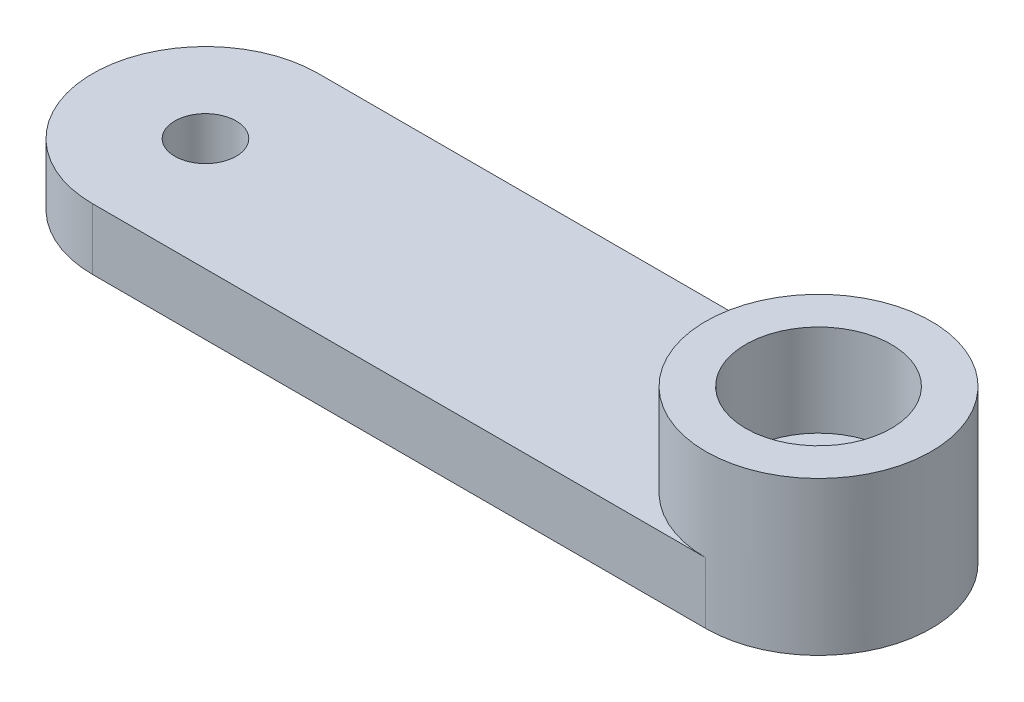
ISO-10303-21;
HEADER;
FILE_DESCRIPTION(('STEP AP214'),'2;1');
FILE_NAME('part.step','',(''),(''),'','','');
FILE_SCHEMA(('AUTOMOTIVE_DESIGN { 1 0 10303 214 1 1 1 1 }'));
ENDSEC;
DATA;
#1=APPLICATION_CONTEXT('core data for automotive mechanical design processes');
#2=APPLICATION_PROTOCOL_DEFINITION('international standard','automotive_design',2000,#1);
#3=PRODUCT_CONTEXT('',#1,'mechanical');
#4=PRODUCT('Part','Part','',(#3));
#5=PRODUCT_RELATED_PRODUCT_CATEGORY('part','',(#4));
#6=PRODUCT_DEFINITION_FORMATION('','',#4);
#7=PRODUCT_DEFINITION_CONTEXT('part definition',#1,'design');
#8=PRODUCT_DEFINITION('design','',#6,#7);
#9=PRODUCT_DEFINITION_SHAPE('','',#8);
#10=(LENGTH_UNIT() NAMED_UNIT(*) SI_UNIT(.MILLI.,.METRE.));
#11=(NAMED_UNIT(*) PLANE_ANGLE_UNIT() SI_UNIT($,.RADIAN.));
#12=(NAMED_UNIT(*) SI_UNIT($,.STERADIAN.) SOLID_ANGLE_UNIT());
#13=UNCERTAINTY_MEASURE_WITH_UNIT(LENGTH_MEASURE(1.E-05),#10,'distance_accuracy_value','');
#14=(GEOMETRIC_REPRESENTATION_CONTEXT(3) GLOBAL_UNCERTAINTY_ASSIGNED_CONTEXT((#13)) GLOBAL_UNIT_ASSIGNED_CONTEXT((#10,
#11,#12)) REPRESENTATION_CONTEXT('',''));
#15=CARTESIAN_POINT('',(0.,0.,0.));
#16=DIRECTION('',(0.,0.,1.));
#17=DIRECTION('',(1.,0.,0.));
#18=AXIS2_PLACEMENT_3D('',#15,#16,#17);
#19=CARTESIAN_POINT('',(0.,0.,0.));
#20=DIRECTION('',(0.,-1.,0.));
#21=DIRECTION('',(0.,0.,-1.));
#22=AXIS2_PLACEMENT_3D('',#19,#20,#21);
#23=CYLINDRICAL_SURFACE('',#22,1.);
#24=CARTESIAN_POINT('',(0.,0.,0.));
#25=DIRECTION('',(0.,-1.,0.));
#26=DIRECTION('',(0.,0.,-1.));
#27=AXIS2_PLACEMENT_3D('',#24,#25,#26);
#28=CIRCLE('',#27,1.);
#29=CARTESIAN_POINT('',(0.,0.,-1.));
#30=VERTEX_POINT('',#29);
#31=EDGE_CURVE('E109',#30,#30,#28,.T.);
#32=ORIENTED_EDGE('',*,*,#31,.F.);
#33=EDGE_LOOP('',(#32));
#34=FACE_BOUND('',#33,.T.);
#35=CARTESIAN_POINT('',(0.,-0.5,0.));
#36=DIRECTION('',(0.,-1.,0.));
#37=DIRECTION('',(0.,0.,-1.));
#38=AXIS2_PLACEMENT_3D('',#35,#36,#37);
#39=CIRCLE('',#38,1.);
#40=CARTESIAN_POINT('',(0.,-0.5,-1.));
#41=VERTEX_POINT('',#40);
#42=EDGE_CURVE('E41',#41,#41,#39,.F.);
#43=ORIENTED_EDGE('',*,*,#42,.F.);
#44=EDGE_LOOP('',(#43));
#45=FACE_BOUND('',#44,.T.);
#46=ADVANCED_FACE('F37',(#34,#45),#23,.F.);
#47=CARTESIAN_POINT('',(0.,-2.,0.));
#48=DIRECTION('',(0.,1.,0.));
#49=DIRECTION('',(0.,0.,1.));
#50=AXIS2_PLACEMENT_3D('',#47,#48,#49);
#51=CYLINDRICAL_SURFACE('',#50,3.68);
#52=DIRECTION('',(0.,-1.,0.));
#53=VECTOR('',#52,1.);
#54=CARTESIAN_POINT('',(0.,0.,-3.68));
#55=LINE('',#54,#53);
#56=CARTESIAN_POINT('',(0.,0.,-3.68));
#57=VERTEX_POINT('',#56);
#58=CARTESIAN_POINT('',(0.,-2.,-3.68));
#59=VERTEX_POINT('',#58);
#60=EDGE_CURVE('E52',#57,#59,#55,.T.);
#61=ORIENTED_EDGE('',*,*,#60,.F.);
#62=CARTESIAN_POINT('',(0.,0.,0.));
#63=DIRECTION('',(0.,-1.,0.));
#64=DIRECTION('',(0.,0.,-1.));
#65=AXIS2_PLACEMENT_3D('',#62,#63,#64);
#66=CIRCLE('',#65,3.68);
#67=CARTESIAN_POINT('',(0.,0.,3.68));
#68=VERTEX_POINT('',#67);
#69=EDGE_CURVE('E11',#57,#68,#66,.F.);
#70=ORIENTED_EDGE('',*,*,#69,.T.);
#71=DIRECTION('',(0.,-1.,0.));
#72=VECTOR('',#71,1.);
#73=CARTESIAN_POINT('',(0.,0.,3.68));
#74=LINE('',#73,#72);
#75=CARTESIAN_POINT('',(0.,-2.,3.68));
#76=VERTEX_POINT('',#75);
#77=EDGE_CURVE('E88',#68,#76,#74,.T.);
#78=ORIENTED_EDGE('',*,*,#77,.T.);
#79=CARTESIAN_POINT('',(0.,-2.,0.));
#80=DIRECTION('',(0.,1.,0.));
#81=DIRECTION('',(0.,0.,1.));
#82=AXIS2_PLACEMENT_3D('',#79,#80,#81);
#83=CIRCLE('',#82,3.68);
#84=EDGE_CURVE('E120',#76,#59,#83,.T.);
#85=ORIENTED_EDGE('',*,*,#84,.T.);
#86=EDGE_LOOP('',(#61,#70,#78,#85));
#87=FACE_BOUND('',#86,.T.);
#88=CARTESIAN_POINT('',(0.,3.,0.));
#89=DIRECTION('',(0.,1.,0.));
#90=DIRECTION('',(0.,0.,1.));
#91=AXIS2_PLACEMENT_3D('',#88,#89,#90);
#92=CIRCLE('',#91,3.68);
#93=CARTESIAN_POINT('',(0.,3.,3.68));
#94=VERTEX_POINT('',#93);
#95=EDGE_CURVE('E117',#94,#94,#92,.T.);
#96=ORIENTED_EDGE('',*,*,#95,.F.);
#97=EDGE_LOOP('',(#96));
#98=FACE_BOUND('',#97,.T.);
#99=ADVANCED_FACE('F39',(#87,#98),#51,.T.);
#100=CARTESIAN_POINT('',(0.,-2.,0.));
#101=DIRECTION('',(0.,1.,0.));
#102=DIRECTION('',(0.,0.,1.));
#103=AXIS2_PLACEMENT_3D('',#100,#101,#102);
#104=PLANE('',#103);
#105=CARTESIAN_POINT('',(0.,-2.,0.));
#106=DIRECTION('',(0.,-1.,0.));
#107=DIRECTION('',(0.,0.,-1.));
#108=AXIS2_PLACEMENT_3D('',#105,#106,#107);
#109=CIRCLE('',#108,2.);
#110=CARTESIAN_POINT('',(0.,-2.,-2.));
#111=VERTEX_POINT('',#110);
#112=EDGE_CURVE('E176',#111,#111,#109,.T.);
#113=ORIENTED_EDGE('',*,*,#112,.F.);
#114=EDGE_LOOP('',(#113));
#115=FACE_BOUND('',#114,.T.);
#116=CARTESIAN_POINT('',(-20.,-2.,0.));
#117=DIRECTION('',(0.,-1.,0.));
#118=DIRECTION('',(0.,0.,-1.));
#119=AXIS2_PLACEMENT_3D('',#116,#117,#118);
#120=CIRCLE('',#119,1.);
#121=CARTESIAN_POINT('',(-20.,-2.,-1.));
#122=VERTEX_POINT('',#121);
#123=EDGE_CURVE('E180',#122,#122,#120,.T.);
#124=ORIENTED_EDGE('',*,*,#123,.F.);
#125=EDGE_LOOP('',(#124));
#126=FACE_BOUND('',#125,.T.);
#127=ORIENTED_EDGE('',*,*,#84,.F.);
#128=DIRECTION('',(-1.,0.,0.));
#129=VECTOR('',#128,1.);
#130=CARTESIAN_POINT('',(0.,-2.,3.68));
#131=LINE('',#130,#129);
#132=CARTESIAN_POINT('',(-20.,-2.,3.68));
#133=VERTEX_POINT('',#132);
#134=EDGE_CURVE('E107',#76,#133,#131,.T.);
#135=ORIENTED_EDGE('',*,*,#134,.T.);
#136=CARTESIAN_POINT('',(-20.,-2.,0.));
#137=DIRECTION('',(0.,-1.,0.));
#138=DIRECTION('',(0.,0.,-1.));
#139=AXIS2_PLACEMENT_3D('',#136,#137,#138);
#140=CIRCLE('',#139,3.68);
#141=CARTESIAN_POINT('',(-20.,-2.,-3.68));
#142=VERTEX_POINT('',#141);
#143=EDGE_CURVE('E82',#133,#142,#140,.T.);
#144=ORIENTED_EDGE('',*,*,#143,.T.);
#145=DIRECTION('',(1.,0.,0.));
#146=VECTOR('',#145,1.);
#147=CARTESIAN_POINT('',(0.,-2.,-3.68));
#148=LINE('',#147,#146);
#149=EDGE_CURVE('E98',#142,#59,#148,.T.);
#150=ORIENTED_EDGE('',*,*,#149,.T.);
#151=EDGE_LOOP('',(#127,#135,#144,#150));
#152=FACE_BOUND('',#151,.T.);
#153=ADVANCED_FACE('F148',(#115,#126,#152),#104,.F.);
#154=CARTESIAN_POINT('',(0.,3.,0.));
#155=DIRECTION('',(0.,1.,0.));
#156=DIRECTION('',(0.,0.,1.));
#157=AXIS2_PLACEMENT_3D('',#154,#155,#156);
#158=PLANE('',#157);
#159=ORIENTED_EDGE('',*,*,#95,.T.);
#160=EDGE_LOOP('',(#159));
#161=FACE_BOUND('',#160,.T.);
#162=CARTESIAN_POINT('',(0.,3.,0.));
#163=DIRECTION('',(0.,1.,0.));
#164=DIRECTION('',(0.,0.,1.));
#165=AXIS2_PLACEMENT_3D('',#162,#163,#164);
#166=CIRCLE('',#165,2.375);
#167=CARTESIAN_POINT('',(0.,3.,2.375));
#168=VERTEX_POINT('',#167);
#169=EDGE_CURVE('E112',#168,#168,#166,.T.);
#170=ORIENTED_EDGE('',*,*,#169,.F.);
#171=EDGE_LOOP('',(#170));
#172=FACE_BOUND('',#171,.T.);
#173=ADVANCED_FACE('F137',(#161,#172),#158,.T.);
#174=CARTESIAN_POINT('',(0.,3.,0.));
#175=DIRECTION('',(0.,-1.,0.));
#176=DIRECTION('',(0.,0.,-1.));
#177=AXIS2_PLACEMENT_3D('',#174,#175,#176);
#178=CYLINDRICAL_SURFACE('',#177,2.375);
#179=ORIENTED_EDGE('',*,*,#169,.T.);
#180=EDGE_LOOP('',(#179));
#181=FACE_BOUND('',#180,.T.);
#182=CARTESIAN_POINT('',(0.,0.,0.));
#183=DIRECTION('',(0.,1.,0.));
#184=DIRECTION('',(0.,0.,1.));
#185=AXIS2_PLACEMENT_3D('',#182,#183,#184);
#186=CIRCLE('',#185,2.375);
#187=CARTESIAN_POINT('',(0.,0.,2.375));
#188=VERTEX_POINT('',#187);
#189=EDGE_CURVE('E46',#188,#188,#186,.F.);
#190=ORIENTED_EDGE('',*,*,#189,.T.);
#191=EDGE_LOOP('',(#190));
#192=FACE_BOUND('',#191,.T.);
#193=ADVANCED_FACE('F125',(#181,#192),#178,.F.);
#194=CARTESIAN_POINT('',(0.,0.,0.));
#195=DIRECTION('',(0.,1.,0.));
#196=DIRECTION('',(0.,0.,1.));
#197=AXIS2_PLACEMENT_3D('',#194,#195,#196);
#198=PLANE('',#197);
#199=ORIENTED_EDGE('',*,*,#31,.T.);
#200=EDGE_LOOP('',(#199));
#201=FACE_BOUND('',#200,.T.);
#202=ORIENTED_EDGE('',*,*,#189,.F.);
#203=EDGE_LOOP('',(#202));
#204=FACE_BOUND('',#203,.T.);
#205=ADVANCED_FACE('F127',(#201,#204),#198,.T.);
#206=CARTESIAN_POINT('',(0.,0.,-3.68));
#207=DIRECTION('',(0.,0.,-1.));
#208=DIRECTION('',(-1.,0.,0.));
#209=AXIS2_PLACEMENT_3D('',#206,#207,#208);
#210=PLANE('',#209);
#211=ORIENTED_EDGE('',*,*,#149,.F.);
#212=DIRECTION('',(0.,-1.,0.));
#213=VECTOR('',#212,1.);
#214=CARTESIAN_POINT('',(-20.,0.,-3.68));
#215=LINE('',#214,#213);
#216=CARTESIAN_POINT('',(-20.,0.,-3.68));
#217=VERTEX_POINT('',#216);
#218=EDGE_CURVE('E87',#217,#142,#215,.T.);
#219=ORIENTED_EDGE('',*,*,#218,.F.);
#220=DIRECTION('',(1.,0.,0.));
#221=VECTOR('',#220,1.);
#222=CARTESIAN_POINT('',(0.,0.,-3.68));
#223=LINE('',#222,#221);
#224=EDGE_CURVE('E95',#217,#57,#223,.T.);
#225=ORIENTED_EDGE('',*,*,#224,.T.);
#226=ORIENTED_EDGE('',*,*,#60,.T.);
#227=EDGE_LOOP('',(#211,#219,#225,#226));
#228=FACE_BOUND('',#227,.T.);
#229=ADVANCED_FACE('F129',(#228),#210,.T.);
#230=CARTESIAN_POINT('',(-20.,0.,0.));
#231=DIRECTION('',(0.,-1.,0.));
#232=DIRECTION('',(0.,0.,-1.));
#233=AXIS2_PLACEMENT_3D('',#230,#231,#232);
#234=CYLINDRICAL_SURFACE('',#233,3.68);
#235=ORIENTED_EDGE('',*,*,#143,.F.);
#236=DIRECTION('',(0.,-1.,0.));
#237=VECTOR('',#236,1.);
#238=CARTESIAN_POINT('',(-20.,0.,3.68));
#239=LINE('',#238,#237);
#240=CARTESIAN_POINT('',(-20.,0.,3.68));
#241=VERTEX_POINT('',#240);
#242=EDGE_CURVE('E76',#241,#133,#239,.T.);
#243=ORIENTED_EDGE('',*,*,#242,.F.);
#244=CARTESIAN_POINT('',(-20.,0.,0.));
#245=DIRECTION('',(0.,-1.,0.));
#246=DIRECTION('',(0.,0.,-1.));
#247=AXIS2_PLACEMENT_3D('',#244,#245,#246);
#248=CIRCLE('',#247,3.68);
#249=EDGE_CURVE('E79',#241,#217,#248,.T.);
#250=ORIENTED_EDGE('',*,*,#249,.T.);
#251=ORIENTED_EDGE('',*,*,#218,.T.);
#252=EDGE_LOOP('',(#235,#243,#250,#251));
#253=FACE_BOUND('',#252,.T.);
#254=ADVANCED_FACE('F78',(#253),#234,.T.);
#255=CARTESIAN_POINT('',(0.,0.,3.68));
#256=DIRECTION('',(0.,0.,1.));
#257=DIRECTION('',(1.,0.,0.));
#258=AXIS2_PLACEMENT_3D('',#255,#256,#257);
#259=PLANE('',#258);
#260=ORIENTED_EDGE('',*,*,#134,.F.);
#261=ORIENTED_EDGE('',*,*,#77,.F.);
#262=DIRECTION('',(-1.,0.,0.));
#263=VECTOR('',#262,1.);
#264=CARTESIAN_POINT('',(0.,0.,3.68));
#265=LINE('',#264,#263);
#266=EDGE_CURVE('E93',#68,#241,#265,.T.);
#267=ORIENTED_EDGE('',*,*,#266,.T.);
#268=ORIENTED_EDGE('',*,*,#242,.T.);
#269=EDGE_LOOP('',(#260,#261,#267,#268));
#270=FACE_BOUND('',#269,.T.);
#271=ADVANCED_FACE('F97',(#270),#259,.T.);
#272=CARTESIAN_POINT('',(0.,0.,0.));
#273=DIRECTION('',(0.,-1.,0.));
#274=DIRECTION('',(0.,0.,-1.));
#275=AXIS2_PLACEMENT_3D('',#272,#273,#274);
#276=PLANE('',#275);
#277=CARTESIAN_POINT('',(-20.,0.,0.));
#278=DIRECTION('',(0.,-1.,0.));
#279=DIRECTION('',(0.,0.,-1.));
#280=AXIS2_PLACEMENT_3D('',#277,#278,#279);
#281=CIRCLE('',#280,1.);
#282=CARTESIAN_POINT('',(-20.,0.,-1.));
#283=VERTEX_POINT('',#282);
#284=EDGE_CURVE('E103',#283,#283,#281,.T.);
#285=ORIENTED_EDGE('',*,*,#284,.T.);
#286=EDGE_LOOP('',(#285));
#287=FACE_BOUND('',#286,.T.);
#288=ORIENTED_EDGE('',*,*,#69,.F.);
#289=ORIENTED_EDGE('',*,*,#224,.F.);
#290=ORIENTED_EDGE('',*,*,#249,.F.);
#291=ORIENTED_EDGE('',*,*,#266,.F.);
#292=EDGE_LOOP('',(#288,#289,#290,#291));
#293=FACE_BOUND('',#292,.T.);
#294=ADVANCED_FACE('F92',(#287,#293),#276,.F.);
#295=CARTESIAN_POINT('',(-20.,0.,0.));
#296=DIRECTION('',(0.,-1.,0.));
#297=DIRECTION('',(0.,0.,-1.));
#298=AXIS2_PLACEMENT_3D('',#295,#296,#297);
#299=CYLINDRICAL_SURFACE('',#298,1.);
#300=ORIENTED_EDGE('',*,*,#284,.F.);
#301=EDGE_LOOP('',(#300));
#302=FACE_BOUND('',#301,.T.);
#303=ORIENTED_EDGE('',*,*,#123,.T.);
#304=EDGE_LOOP('',(#303));
#305=FACE_BOUND('',#304,.T.);
#306=ADVANCED_FACE('F155',(#302,#305),#299,.F.);
#307=CARTESIAN_POINT('',(0.,-0.5,0.));
#308=DIRECTION('',(0.,-1.,0.));
#309=DIRECTION('',(0.,0.,-1.));
#310=AXIS2_PLACEMENT_3D('',#307,#308,#309);
#311=PLANE('',#310);
#312=CARTESIAN_POINT('',(0.,-0.5,0.));
#313=DIRECTION('',(0.,-1.,0.));
#314=DIRECTION('',(0.,0.,-1.));
#315=AXIS2_PLACEMENT_3D('',#312,#313,#314);
#316=CIRCLE('',#315,2.);
#317=CARTESIAN_POINT('',(0.,-0.5,-2.));
#318=VERTEX_POINT('',#317);
#319=EDGE_CURVE('E191',#318,#318,#316,.T.);
#320=ORIENTED_EDGE('',*,*,#319,.T.);
#321=EDGE_LOOP('',(#320));
#322=FACE_BOUND('',#321,.T.);
#323=ORIENTED_EDGE('',*,*,#42,.T.);
#324=EDGE_LOOP('',(#323));
#325=FACE_BOUND('',#324,.T.);
#326=ADVANCED_FACE('F158',(#322,#325),#311,.T.);
#327=CARTESIAN_POINT('',(0.,-0.5,0.));
#328=DIRECTION('',(0.,-1.,0.));
#329=DIRECTION('',(0.,0.,-1.));
#330=AXIS2_PLACEMENT_3D('',#327,#328,#329);
#331=CYLINDRICAL_SURFACE('',#330,2.);
#332=ORIENTED_EDGE('',*,*,#319,.F.);
#333=EDGE_LOOP('',(#332));
#334=FACE_BOUND('',#333,.T.);
#335=ORIENTED_EDGE('',*,*,#112,.T.);
#336=EDGE_LOOP('',(#335));
#337=FACE_BOUND('',#336,.T.);
#338=ADVANCED_FACE('F153',(#334,#337),#331,.F.);
#339=CLOSED_SHELL('',(#46,#99,#153,#173,#193,#205,#229,#254,#271,#294,#306,#326,#338));
#340=MANIFOLD_SOLID_BREP('B2',#339);
#341=ADVANCED_BREP_SHAPE_REPRESENTATION('',(#18,#340),#14);
#342=SHAPE_DEFINITION_REPRESENTATION(#9,#341);
ENDSEC;
END-ISO-10303-21;
